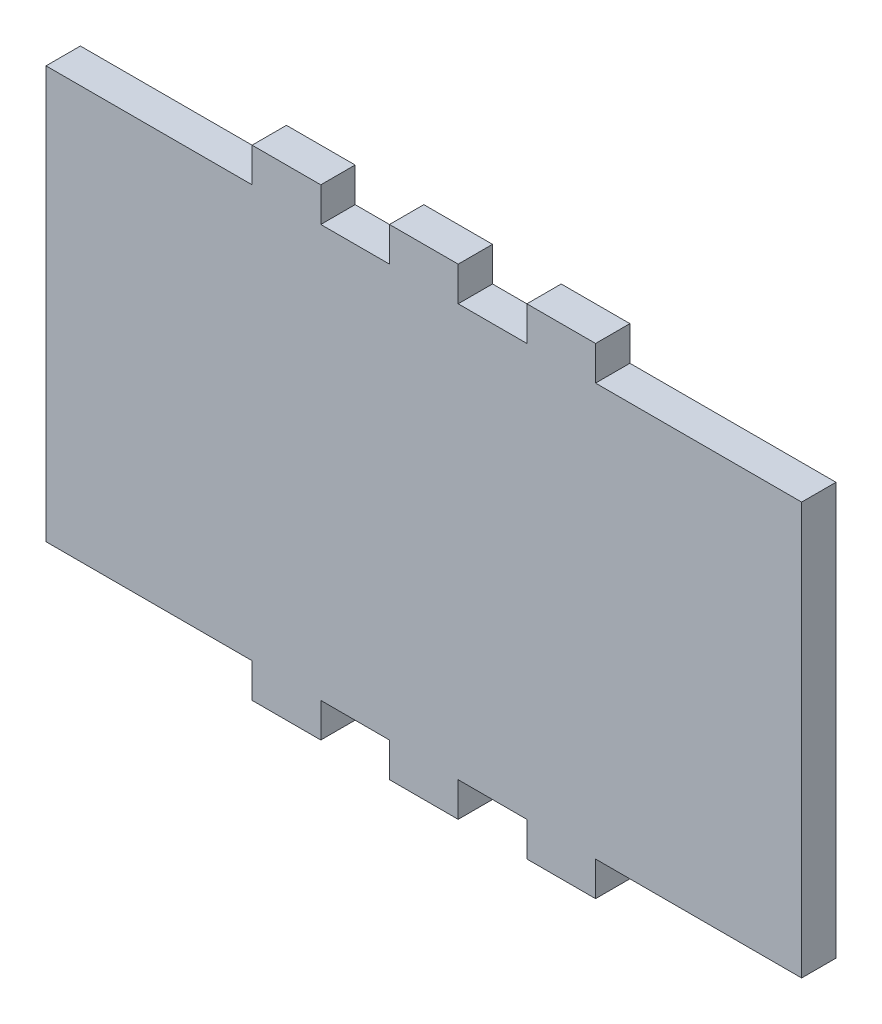
ISO-10303-21;
HEADER;
FILE_DESCRIPTION(('STEP AP214'),'2;1');
FILE_NAME('part.step','',(''),(''),'','','');
FILE_SCHEMA(('AUTOMOTIVE_DESIGN { 1 0 10303 214 1 1 1 1 }'));
ENDSEC;
DATA;
#1=APPLICATION_CONTEXT('core data for automotive mechanical design processes');
#2=APPLICATION_PROTOCOL_DEFINITION('international standard','automotive_design',2000,#1);
#3=PRODUCT_CONTEXT('',#1,'mechanical');
#4=PRODUCT('Part','Part','',(#3));
#5=PRODUCT_RELATED_PRODUCT_CATEGORY('part','',(#4));
#6=PRODUCT_DEFINITION_FORMATION('','',#4);
#7=PRODUCT_DEFINITION_CONTEXT('part definition',#1,'design');
#8=PRODUCT_DEFINITION('design','',#6,#7);
#9=PRODUCT_DEFINITION_SHAPE('','',#8);
#10=(LENGTH_UNIT() NAMED_UNIT(*) SI_UNIT(.MILLI.,.METRE.));
#11=(NAMED_UNIT(*) PLANE_ANGLE_UNIT() SI_UNIT($,.RADIAN.));
#12=(NAMED_UNIT(*) SI_UNIT($,.STERADIAN.) SOLID_ANGLE_UNIT());
#13=UNCERTAINTY_MEASURE_WITH_UNIT(LENGTH_MEASURE(1.E-05),#10,'distance_accuracy_value','');
#14=(GEOMETRIC_REPRESENTATION_CONTEXT(3) GLOBAL_UNCERTAINTY_ASSIGNED_CONTEXT((#13)) GLOBAL_UNIT_ASSIGNED_CONTEXT((#10,
#11,#12)) REPRESENTATION_CONTEXT('',''));
#15=CARTESIAN_POINT('',(0.,0.,0.));
#16=DIRECTION('',(0.,0.,1.));
#17=DIRECTION('',(1.,0.,0.));
#18=AXIS2_PLACEMENT_3D('',#15,#16,#17);
#19=CARTESIAN_POINT('',(15.875,19.05,3.175));
#20=DIRECTION('',(0.,-1.,0.));
#21=DIRECTION('',(0.,0.,-1.));
#22=AXIS2_PLACEMENT_3D('',#19,#20,#21);
#23=PLANE('',#22);
#24=DIRECTION('',(-1.,0.,0.));
#25=VECTOR('',#24,1.);
#26=CARTESIAN_POINT('',(15.875,19.05,0.));
#27=LINE('',#26,#25);
#28=CARTESIAN_POINT('',(34.925,19.05,0.));
#29=VERTEX_POINT('',#28);
#30=CARTESIAN_POINT('',(15.875,19.05,0.));
#31=VERTEX_POINT('',#30);
#32=EDGE_CURVE('E251',#29,#31,#27,.T.);
#33=ORIENTED_EDGE('',*,*,#32,.T.);
#34=DIRECTION('',(0.,0.,-1.));
#35=VECTOR('',#34,1.);
#36=CARTESIAN_POINT('',(15.875,19.05,3.175));
#37=LINE('',#36,#35);
#38=CARTESIAN_POINT('',(15.875,19.05,3.175));
#39=VERTEX_POINT('',#38);
#40=EDGE_CURVE('E11',#39,#31,#37,.T.);
#41=ORIENTED_EDGE('',*,*,#40,.F.);
#42=DIRECTION('',(-1.,0.,0.));
#43=VECTOR('',#42,1.);
#44=CARTESIAN_POINT('',(15.875,19.05,3.175));
#45=LINE('',#44,#43);
#46=CARTESIAN_POINT('',(34.925,19.05,3.175));
#47=VERTEX_POINT('',#46);
#48=EDGE_CURVE('E305',#47,#39,#45,.T.);
#49=ORIENTED_EDGE('',*,*,#48,.F.);
#50=DIRECTION('',(0.,0.,-1.));
#51=VECTOR('',#50,1.);
#52=CARTESIAN_POINT('',(34.925,19.05,3.175));
#53=LINE('',#52,#51);
#54=EDGE_CURVE('E247',#47,#29,#53,.T.);
#55=ORIENTED_EDGE('',*,*,#54,.T.);
#56=EDGE_LOOP('',(#33,#41,#49,#55));
#57=FACE_BOUND('',#56,.T.);
#58=ADVANCED_FACE('F35',(#57),#23,.F.);
#59=CARTESIAN_POINT('',(15.875,22.225,3.175));
#60=DIRECTION('',(-1.,0.,0.));
#61=DIRECTION('',(0.,0.,1.));
#62=AXIS2_PLACEMENT_3D('',#59,#60,#61);
#63=PLANE('',#62);
#64=DIRECTION('',(0.,1.,0.));
#65=VECTOR('',#64,1.);
#66=CARTESIAN_POINT('',(15.875,22.225,0.));
#67=LINE('',#66,#65);
#68=CARTESIAN_POINT('',(15.875,22.225,0.));
#69=VERTEX_POINT('',#68);
#70=EDGE_CURVE('E254',#31,#69,#67,.T.);
#71=ORIENTED_EDGE('',*,*,#70,.T.);
#72=DIRECTION('',(0.,0.,-1.));
#73=VECTOR('',#72,1.);
#74=CARTESIAN_POINT('',(15.875,22.225,3.175));
#75=LINE('',#74,#73);
#76=CARTESIAN_POINT('',(15.875,22.225,3.175));
#77=VERTEX_POINT('',#76);
#78=EDGE_CURVE('E43',#77,#69,#75,.T.);
#79=ORIENTED_EDGE('',*,*,#78,.F.);
#80=DIRECTION('',(0.,1.,0.));
#81=VECTOR('',#80,1.);
#82=CARTESIAN_POINT('',(15.875,22.225,3.175));
#83=LINE('',#82,#81);
#84=EDGE_CURVE('E154',#39,#77,#83,.T.);
#85=ORIENTED_EDGE('',*,*,#84,.F.);
#86=ORIENTED_EDGE('',*,*,#40,.T.);
#87=EDGE_LOOP('',(#71,#79,#85,#86));
#88=FACE_BOUND('',#87,.T.);
#89=ADVANCED_FACE('F463',(#88),#63,.F.);
#90=CARTESIAN_POINT('',(9.52500000000001,22.225,3.175));
#91=DIRECTION('',(0.,-1.,0.));
#92=DIRECTION('',(0.,0.,-1.));
#93=AXIS2_PLACEMENT_3D('',#90,#91,#92);
#94=PLANE('',#93);
#95=DIRECTION('',(-1.,0.,0.));
#96=VECTOR('',#95,1.);
#97=CARTESIAN_POINT('',(9.52500000000001,22.225,0.));
#98=LINE('',#97,#96);
#99=CARTESIAN_POINT('',(9.52500000000001,22.225,0.));
#100=VERTEX_POINT('',#99);
#101=EDGE_CURVE('E256',#69,#100,#98,.T.);
#102=ORIENTED_EDGE('',*,*,#101,.T.);
#103=DIRECTION('',(0.,0.,-1.));
#104=VECTOR('',#103,1.);
#105=CARTESIAN_POINT('',(9.52500000000001,22.225,3.175));
#106=LINE('',#105,#104);
#107=CARTESIAN_POINT('',(9.52500000000001,22.225,3.175));
#108=VERTEX_POINT('',#107);
#109=EDGE_CURVE('E372',#108,#100,#106,.T.);
#110=ORIENTED_EDGE('',*,*,#109,.F.);
#111=DIRECTION('',(-1.,0.,0.));
#112=VECTOR('',#111,1.);
#113=CARTESIAN_POINT('',(9.52500000000001,22.225,3.175));
#114=LINE('',#113,#112);
#115=EDGE_CURVE('E380',#77,#108,#114,.T.);
#116=ORIENTED_EDGE('',*,*,#115,.F.);
#117=ORIENTED_EDGE('',*,*,#78,.T.);
#118=EDGE_LOOP('',(#102,#110,#116,#117));
#119=FACE_BOUND('',#118,.T.);
#120=ADVANCED_FACE('F378',(#119),#94,.F.);
#121=CARTESIAN_POINT('',(9.52500000000001,19.05,3.175));
#122=DIRECTION('',(1.,0.,0.));
#123=DIRECTION('',(0.,1.,0.));
#124=AXIS2_PLACEMENT_3D('',#121,#122,#123);
#125=PLANE('',#124);
#126=DIRECTION('',(0.,-1.,0.));
#127=VECTOR('',#126,1.);
#128=CARTESIAN_POINT('',(9.52500000000001,19.05,0.));
#129=LINE('',#128,#127);
#130=CARTESIAN_POINT('',(9.52500000000001,19.05,0.));
#131=VERTEX_POINT('',#130);
#132=EDGE_CURVE('E258',#100,#131,#129,.T.);
#133=ORIENTED_EDGE('',*,*,#132,.T.);
#134=DIRECTION('',(0.,0.,-1.));
#135=VECTOR('',#134,1.);
#136=CARTESIAN_POINT('',(9.52500000000001,19.05,3.175));
#137=LINE('',#136,#135);
#138=CARTESIAN_POINT('',(9.52500000000001,19.05,3.175));
#139=VERTEX_POINT('',#138);
#140=EDGE_CURVE('E369',#139,#131,#137,.T.);
#141=ORIENTED_EDGE('',*,*,#140,.F.);
#142=DIRECTION('',(0.,-1.,0.));
#143=VECTOR('',#142,1.);
#144=CARTESIAN_POINT('',(9.52500000000001,19.05,3.175));
#145=LINE('',#144,#143);
#146=EDGE_CURVE('E398',#108,#139,#145,.T.);
#147=ORIENTED_EDGE('',*,*,#146,.F.);
#148=ORIENTED_EDGE('',*,*,#109,.T.);
#149=EDGE_LOOP('',(#133,#141,#147,#148));
#150=FACE_BOUND('',#149,.T.);
#151=ADVANCED_FACE('F389',(#150),#125,.F.);
#152=CARTESIAN_POINT('',(3.17500000000001,19.05,3.175));
#153=DIRECTION('',(0.,-1.,0.));
#154=DIRECTION('',(0.,0.,-1.));
#155=AXIS2_PLACEMENT_3D('',#152,#153,#154);
#156=PLANE('',#155);
#157=DIRECTION('',(-1.,0.,0.));
#158=VECTOR('',#157,1.);
#159=CARTESIAN_POINT('',(3.17500000000001,19.05,0.));
#160=LINE('',#159,#158);
#161=CARTESIAN_POINT('',(3.17500000000001,19.05,0.));
#162=VERTEX_POINT('',#161);
#163=EDGE_CURVE('E260',#131,#162,#160,.T.);
#164=ORIENTED_EDGE('',*,*,#163,.T.);
#165=DIRECTION('',(0.,0.,-1.));
#166=VECTOR('',#165,1.);
#167=CARTESIAN_POINT('',(3.17500000000001,19.05,3.175));
#168=LINE('',#167,#166);
#169=CARTESIAN_POINT('',(3.17500000000001,19.05,3.175));
#170=VERTEX_POINT('',#169);
#171=EDGE_CURVE('E366',#170,#162,#168,.T.);
#172=ORIENTED_EDGE('',*,*,#171,.F.);
#173=DIRECTION('',(-1.,0.,0.));
#174=VECTOR('',#173,1.);
#175=CARTESIAN_POINT('',(3.17500000000001,19.05,3.175));
#176=LINE('',#175,#174);
#177=EDGE_CURVE('E395',#139,#170,#176,.T.);
#178=ORIENTED_EDGE('',*,*,#177,.F.);
#179=ORIENTED_EDGE('',*,*,#140,.T.);
#180=EDGE_LOOP('',(#164,#172,#178,#179));
#181=FACE_BOUND('',#180,.T.);
#182=ADVANCED_FACE('F393',(#181),#156,.F.);
#183=CARTESIAN_POINT('',(3.17500000000001,22.225,3.175));
#184=DIRECTION('',(-1.,0.,0.));
#185=DIRECTION('',(0.,-1.,0.));
#186=AXIS2_PLACEMENT_3D('',#183,#184,#185);
#187=PLANE('',#186);
#188=DIRECTION('',(0.,1.,0.));
#189=VECTOR('',#188,1.);
#190=CARTESIAN_POINT('',(3.17500000000001,22.225,0.));
#191=LINE('',#190,#189);
#192=CARTESIAN_POINT('',(3.17500000000001,22.225,0.));
#193=VERTEX_POINT('',#192);
#194=EDGE_CURVE('E262',#162,#193,#191,.T.);
#195=ORIENTED_EDGE('',*,*,#194,.T.);
#196=DIRECTION('',(0.,0.,-1.));
#197=VECTOR('',#196,1.);
#198=CARTESIAN_POINT('',(3.17500000000001,22.225,3.175));
#199=LINE('',#198,#197);
#200=CARTESIAN_POINT('',(3.17500000000001,22.225,3.175));
#201=VERTEX_POINT('',#200);
#202=EDGE_CURVE('E363',#201,#193,#199,.T.);
#203=ORIENTED_EDGE('',*,*,#202,.F.);
#204=DIRECTION('',(0.,1.,0.));
#205=VECTOR('',#204,1.);
#206=CARTESIAN_POINT('',(3.17500000000001,22.225,3.175));
#207=LINE('',#206,#205);
#208=EDGE_CURVE('E397',#170,#201,#207,.T.);
#209=ORIENTED_EDGE('',*,*,#208,.F.);
#210=ORIENTED_EDGE('',*,*,#171,.T.);
#211=EDGE_LOOP('',(#195,#203,#209,#210));
#212=FACE_BOUND('',#211,.T.);
#213=ADVANCED_FACE('F476',(#212),#187,.F.);
#214=CARTESIAN_POINT('',(-3.17499999999998,22.225,3.175));
#215=DIRECTION('',(0.,-1.,0.));
#216=DIRECTION('',(0.,0.,-1.));
#217=AXIS2_PLACEMENT_3D('',#214,#215,#216);
#218=PLANE('',#217);
#219=DIRECTION('',(-1.,0.,0.));
#220=VECTOR('',#219,1.);
#221=CARTESIAN_POINT('',(-3.17499999999998,22.225,0.));
#222=LINE('',#221,#220);
#223=CARTESIAN_POINT('',(-3.17499999999998,22.225,0.));
#224=VERTEX_POINT('',#223);
#225=EDGE_CURVE('E264',#193,#224,#222,.T.);
#226=ORIENTED_EDGE('',*,*,#225,.T.);
#227=DIRECTION('',(0.,0.,-1.));
#228=VECTOR('',#227,1.);
#229=CARTESIAN_POINT('',(-3.17499999999998,22.225,3.175));
#230=LINE('',#229,#228);
#231=CARTESIAN_POINT('',(-3.17499999999998,22.225,3.175));
#232=VERTEX_POINT('',#231);
#233=EDGE_CURVE('E360',#232,#224,#230,.T.);
#234=ORIENTED_EDGE('',*,*,#233,.F.);
#235=DIRECTION('',(-1.,0.,0.));
#236=VECTOR('',#235,1.);
#237=CARTESIAN_POINT('',(-3.17499999999998,22.225,3.175));
#238=LINE('',#237,#236);
#239=EDGE_CURVE('E400',#201,#232,#238,.T.);
#240=ORIENTED_EDGE('',*,*,#239,.F.);
#241=ORIENTED_EDGE('',*,*,#202,.T.);
#242=EDGE_LOOP('',(#226,#234,#240,#241));
#243=FACE_BOUND('',#242,.T.);
#244=ADVANCED_FACE('F479',(#243),#218,.F.);
#245=CARTESIAN_POINT('',(-3.17499999999998,19.05,3.175));
#246=DIRECTION('',(1.,0.,0.));
#247=DIRECTION('',(0.,0.,-1.));
#248=AXIS2_PLACEMENT_3D('',#245,#246,#247);
#249=PLANE('',#248);
#250=DIRECTION('',(0.,-1.,0.));
#251=VECTOR('',#250,1.);
#252=CARTESIAN_POINT('',(-3.17499999999998,19.05,0.));
#253=LINE('',#252,#251);
#254=CARTESIAN_POINT('',(-3.17499999999998,19.05,0.));
#255=VERTEX_POINT('',#254);
#256=EDGE_CURVE('E266',#224,#255,#253,.T.);
#257=ORIENTED_EDGE('',*,*,#256,.T.);
#258=DIRECTION('',(0.,0.,-1.));
#259=VECTOR('',#258,1.);
#260=CARTESIAN_POINT('',(-3.17499999999998,19.05,3.175));
#261=LINE('',#260,#259);
#262=CARTESIAN_POINT('',(-3.17499999999998,19.05,3.175));
#263=VERTEX_POINT('',#262);
#264=EDGE_CURVE('E357',#263,#255,#261,.T.);
#265=ORIENTED_EDGE('',*,*,#264,.F.);
#266=DIRECTION('',(0.,-1.,0.));
#267=VECTOR('',#266,1.);
#268=CARTESIAN_POINT('',(-3.17499999999998,19.05,3.175));
#269=LINE('',#268,#267);
#270=EDGE_CURVE('E406',#232,#263,#269,.T.);
#271=ORIENTED_EDGE('',*,*,#270,.F.);
#272=ORIENTED_EDGE('',*,*,#233,.T.);
#273=EDGE_LOOP('',(#257,#265,#271,#272));
#274=FACE_BOUND('',#273,.T.);
#275=ADVANCED_FACE('F483',(#274),#249,.F.);
#276=CARTESIAN_POINT('',(-9.52499999999998,19.05,3.175));
#277=DIRECTION('',(0.,-1.,0.));
#278=DIRECTION('',(0.,0.,-1.));
#279=AXIS2_PLACEMENT_3D('',#276,#277,#278);
#280=PLANE('',#279);
#281=DIRECTION('',(-1.,0.,0.));
#282=VECTOR('',#281,1.);
#283=CARTESIAN_POINT('',(-9.52499999999998,19.05,0.));
#284=LINE('',#283,#282);
#285=CARTESIAN_POINT('',(-9.52499999999998,19.05,0.));
#286=VERTEX_POINT('',#285);
#287=EDGE_CURVE('E268',#255,#286,#284,.T.);
#288=ORIENTED_EDGE('',*,*,#287,.T.);
#289=DIRECTION('',(0.,0.,-1.));
#290=VECTOR('',#289,1.);
#291=CARTESIAN_POINT('',(-9.52499999999998,19.05,3.175));
#292=LINE('',#291,#290);
#293=CARTESIAN_POINT('',(-9.52499999999998,19.05,3.175));
#294=VERTEX_POINT('',#293);
#295=EDGE_CURVE('E354',#294,#286,#292,.T.);
#296=ORIENTED_EDGE('',*,*,#295,.F.);
#297=DIRECTION('',(-1.,0.,0.));
#298=VECTOR('',#297,1.);
#299=CARTESIAN_POINT('',(-9.52499999999998,19.05,3.175));
#300=LINE('',#299,#298);
#301=EDGE_CURVE('E408',#263,#294,#300,.T.);
#302=ORIENTED_EDGE('',*,*,#301,.F.);
#303=ORIENTED_EDGE('',*,*,#264,.T.);
#304=EDGE_LOOP('',(#288,#296,#302,#303));
#305=FACE_BOUND('',#304,.T.);
#306=ADVANCED_FACE('F487',(#305),#280,.F.);
#307=CARTESIAN_POINT('',(-9.52499999999998,22.225,3.175));
#308=DIRECTION('',(-1.,0.,0.));
#309=DIRECTION('',(0.,-1.,0.));
#310=AXIS2_PLACEMENT_3D('',#307,#308,#309);
#311=PLANE('',#310);
#312=DIRECTION('',(0.,1.,0.));
#313=VECTOR('',#312,1.);
#314=CARTESIAN_POINT('',(-9.52499999999998,22.225,0.));
#315=LINE('',#314,#313);
#316=CARTESIAN_POINT('',(-9.52499999999998,22.225,0.));
#317=VERTEX_POINT('',#316);
#318=EDGE_CURVE('E270',#286,#317,#315,.T.);
#319=ORIENTED_EDGE('',*,*,#318,.T.);
#320=DIRECTION('',(0.,0.,-1.));
#321=VECTOR('',#320,1.);
#322=CARTESIAN_POINT('',(-9.52499999999998,22.225,3.175));
#323=LINE('',#322,#321);
#324=CARTESIAN_POINT('',(-9.52499999999998,22.225,3.175));
#325=VERTEX_POINT('',#324);
#326=EDGE_CURVE('E351',#325,#317,#323,.T.);
#327=ORIENTED_EDGE('',*,*,#326,.F.);
#328=DIRECTION('',(0.,1.,0.));
#329=VECTOR('',#328,1.);
#330=CARTESIAN_POINT('',(-9.52499999999998,22.225,3.175));
#331=LINE('',#330,#329);
#332=EDGE_CURVE('E410',#294,#325,#331,.T.);
#333=ORIENTED_EDGE('',*,*,#332,.F.);
#334=ORIENTED_EDGE('',*,*,#295,.T.);
#335=EDGE_LOOP('',(#319,#327,#333,#334));
#336=FACE_BOUND('',#335,.T.);
#337=ADVANCED_FACE('F491',(#336),#311,.F.);
#338=CARTESIAN_POINT('',(-15.875,22.225,3.175));
#339=DIRECTION('',(0.,-1.,0.));
#340=DIRECTION('',(1.,0.,0.));
#341=AXIS2_PLACEMENT_3D('',#338,#339,#340);
#342=PLANE('',#341);
#343=DIRECTION('',(-1.,0.,0.));
#344=VECTOR('',#343,1.);
#345=CARTESIAN_POINT('',(-15.875,22.225,0.));
#346=LINE('',#345,#344);
#347=CARTESIAN_POINT('',(-15.875,22.225,0.));
#348=VERTEX_POINT('',#347);
#349=EDGE_CURVE('E272',#317,#348,#346,.T.);
#350=ORIENTED_EDGE('',*,*,#349,.T.);
#351=DIRECTION('',(0.,0.,-1.));
#352=VECTOR('',#351,1.);
#353=CARTESIAN_POINT('',(-15.875,22.225,3.175));
#354=LINE('',#353,#352);
#355=CARTESIAN_POINT('',(-15.875,22.225,3.175));
#356=VERTEX_POINT('',#355);
#357=EDGE_CURVE('E348',#356,#348,#354,.T.);
#358=ORIENTED_EDGE('',*,*,#357,.F.);
#359=DIRECTION('',(-1.,0.,0.));
#360=VECTOR('',#359,1.);
#361=CARTESIAN_POINT('',(-15.875,22.225,3.175));
#362=LINE('',#361,#360);
#363=EDGE_CURVE('E412',#325,#356,#362,.T.);
#364=ORIENTED_EDGE('',*,*,#363,.F.);
#365=ORIENTED_EDGE('',*,*,#326,.T.);
#366=EDGE_LOOP('',(#350,#358,#364,#365));
#367=FACE_BOUND('',#366,.T.);
#368=ADVANCED_FACE('F495',(#367),#342,.F.);
#369=CARTESIAN_POINT('',(-15.875,19.05,3.175));
#370=DIRECTION('',(1.,0.,0.));
#371=DIRECTION('',(0.,0.,-1.));
#372=AXIS2_PLACEMENT_3D('',#369,#370,#371);
#373=PLANE('',#372);
#374=DIRECTION('',(0.,-1.,0.));
#375=VECTOR('',#374,1.);
#376=CARTESIAN_POINT('',(-15.875,19.05,0.));
#377=LINE('',#376,#375);
#378=CARTESIAN_POINT('',(-15.875,19.05,0.));
#379=VERTEX_POINT('',#378);
#380=EDGE_CURVE('E274',#348,#379,#377,.T.);
#381=ORIENTED_EDGE('',*,*,#380,.T.);
#382=DIRECTION('',(0.,0.,-1.));
#383=VECTOR('',#382,1.);
#384=CARTESIAN_POINT('',(-15.875,19.05,3.175));
#385=LINE('',#384,#383);
#386=CARTESIAN_POINT('',(-15.875,19.05,3.175));
#387=VERTEX_POINT('',#386);
#388=EDGE_CURVE('E345',#387,#379,#385,.T.);
#389=ORIENTED_EDGE('',*,*,#388,.F.);
#390=DIRECTION('',(0.,-1.,0.));
#391=VECTOR('',#390,1.);
#392=CARTESIAN_POINT('',(-15.875,19.05,3.175));
#393=LINE('',#392,#391);
#394=EDGE_CURVE('E414',#356,#387,#393,.T.);
#395=ORIENTED_EDGE('',*,*,#394,.F.);
#396=ORIENTED_EDGE('',*,*,#357,.T.);
#397=EDGE_LOOP('',(#381,#389,#395,#396));
#398=FACE_BOUND('',#397,.T.);
#399=ADVANCED_FACE('F499',(#398),#373,.F.);
#400=CARTESIAN_POINT('',(-15.875,19.05,3.175));
#401=DIRECTION('',(0.,-1.,0.));
#402=DIRECTION('',(0.,0.,-1.));
#403=AXIS2_PLACEMENT_3D('',#400,#401,#402);
#404=PLANE('',#403);
#405=DIRECTION('',(-1.,0.,0.));
#406=VECTOR('',#405,1.);
#407=CARTESIAN_POINT('',(-15.875,19.05,0.));
#408=LINE('',#407,#406);
#409=CARTESIAN_POINT('',(-34.925,19.05,0.));
#410=VERTEX_POINT('',#409);
#411=EDGE_CURVE('E276',#379,#410,#408,.T.);
#412=ORIENTED_EDGE('',*,*,#411,.T.);
#413=DIRECTION('',(0.,0.,-1.));
#414=VECTOR('',#413,1.);
#415=CARTESIAN_POINT('',(-34.925,19.05,3.175));
#416=LINE('',#415,#414);
#417=CARTESIAN_POINT('',(-34.925,19.05,3.175));
#418=VERTEX_POINT('',#417);
#419=EDGE_CURVE('E342',#418,#410,#416,.T.);
#420=ORIENTED_EDGE('',*,*,#419,.F.);
#421=DIRECTION('',(-1.,0.,0.));
#422=VECTOR('',#421,1.);
#423=CARTESIAN_POINT('',(-15.875,19.05,3.175));
#424=LINE('',#423,#422);
#425=EDGE_CURVE('E416',#387,#418,#424,.T.);
#426=ORIENTED_EDGE('',*,*,#425,.F.);
#427=ORIENTED_EDGE('',*,*,#388,.T.);
#428=EDGE_LOOP('',(#412,#420,#426,#427));
#429=FACE_BOUND('',#428,.T.);
#430=ADVANCED_FACE('F503',(#429),#404,.F.);
#431=CARTESIAN_POINT('',(-34.925,-19.05,3.175));
#432=DIRECTION('',(1.,0.,0.));
#433=DIRECTION('',(0.,0.,-1.));
#434=AXIS2_PLACEMENT_3D('',#431,#432,#433);
#435=PLANE('',#434);
#436=DIRECTION('',(0.,-1.,0.));
#437=VECTOR('',#436,1.);
#438=CARTESIAN_POINT('',(-34.925,-19.05,0.));
#439=LINE('',#438,#437);
#440=CARTESIAN_POINT('',(-34.925,-19.05,0.));
#441=VERTEX_POINT('',#440);
#442=EDGE_CURVE('E278',#410,#441,#439,.T.);
#443=ORIENTED_EDGE('',*,*,#442,.T.);
#444=DIRECTION('',(0.,0.,-1.));
#445=VECTOR('',#444,1.);
#446=CARTESIAN_POINT('',(-34.925,-19.05,3.175));
#447=LINE('',#446,#445);
#448=CARTESIAN_POINT('',(-34.925,-19.05,3.175));
#449=VERTEX_POINT('',#448);
#450=EDGE_CURVE('E339',#449,#441,#447,.T.);
#451=ORIENTED_EDGE('',*,*,#450,.F.);
#452=DIRECTION('',(0.,-1.,0.));
#453=VECTOR('',#452,1.);
#454=CARTESIAN_POINT('',(-34.925,-19.05,3.175));
#455=LINE('',#454,#453);
#456=EDGE_CURVE('E418',#418,#449,#455,.T.);
#457=ORIENTED_EDGE('',*,*,#456,.F.);
#458=ORIENTED_EDGE('',*,*,#419,.T.);
#459=EDGE_LOOP('',(#443,#451,#457,#458));
#460=FACE_BOUND('',#459,.T.);
#461=ADVANCED_FACE('F507',(#460),#435,.F.);
#462=CARTESIAN_POINT('',(-15.875,-19.05,3.175));
#463=DIRECTION('',(0.,1.,0.));
#464=DIRECTION('',(0.,0.,1.));
#465=AXIS2_PLACEMENT_3D('',#462,#463,#464);
#466=PLANE('',#465);
#467=DIRECTION('',(1.,0.,0.));
#468=VECTOR('',#467,1.);
#469=CARTESIAN_POINT('',(-15.875,-19.05,0.));
#470=LINE('',#469,#468);
#471=CARTESIAN_POINT('',(-15.875,-19.05,0.));
#472=VERTEX_POINT('',#471);
#473=EDGE_CURVE('E280',#441,#472,#470,.T.);
#474=ORIENTED_EDGE('',*,*,#473,.T.);
#475=DIRECTION('',(0.,0.,-1.));
#476=VECTOR('',#475,1.);
#477=CARTESIAN_POINT('',(-15.875,-19.05,3.175));
#478=LINE('',#477,#476);
#479=CARTESIAN_POINT('',(-15.875,-19.05,3.175));
#480=VERTEX_POINT('',#479);
#481=EDGE_CURVE('E336',#480,#472,#478,.T.);
#482=ORIENTED_EDGE('',*,*,#481,.F.);
#483=DIRECTION('',(1.,0.,0.));
#484=VECTOR('',#483,1.);
#485=CARTESIAN_POINT('',(-15.875,-19.05,3.175));
#486=LINE('',#485,#484);
#487=EDGE_CURVE('E420',#449,#480,#486,.T.);
#488=ORIENTED_EDGE('',*,*,#487,.F.);
#489=ORIENTED_EDGE('',*,*,#450,.T.);
#490=EDGE_LOOP('',(#474,#482,#488,#489));
#491=FACE_BOUND('',#490,.T.);
#492=ADVANCED_FACE('F511',(#491),#466,.F.);
#493=CARTESIAN_POINT('',(-15.875,-19.05,3.175));
#494=DIRECTION('',(1.,0.,0.));
#495=DIRECTION('',(0.,0.,-1.));
#496=AXIS2_PLACEMENT_3D('',#493,#494,#495);
#497=PLANE('',#496);
#498=DIRECTION('',(0.,-1.,0.));
#499=VECTOR('',#498,1.);
#500=CARTESIAN_POINT('',(-15.875,-19.05,0.));
#501=LINE('',#500,#499);
#502=CARTESIAN_POINT('',(-15.875,-22.225,0.));
#503=VERTEX_POINT('',#502);
#504=EDGE_CURVE('E282',#472,#503,#501,.T.);
#505=ORIENTED_EDGE('',*,*,#504,.T.);
#506=DIRECTION('',(0.,0.,-1.));
#507=VECTOR('',#506,1.);
#508=CARTESIAN_POINT('',(-15.875,-22.225,3.175));
#509=LINE('',#508,#507);
#510=CARTESIAN_POINT('',(-15.875,-22.225,3.175));
#511=VERTEX_POINT('',#510);
#512=EDGE_CURVE('E333',#511,#503,#509,.T.);
#513=ORIENTED_EDGE('',*,*,#512,.F.);
#514=DIRECTION('',(0.,-1.,0.));
#515=VECTOR('',#514,1.);
#516=CARTESIAN_POINT('',(-15.875,-19.05,3.175));
#517=LINE('',#516,#515);
#518=EDGE_CURVE('E422',#480,#511,#517,.T.);
#519=ORIENTED_EDGE('',*,*,#518,.F.);
#520=ORIENTED_EDGE('',*,*,#481,.T.);
#521=EDGE_LOOP('',(#505,#513,#519,#520));
#522=FACE_BOUND('',#521,.T.);
#523=ADVANCED_FACE('F515',(#522),#497,.F.);
#524=CARTESIAN_POINT('',(-15.875,-22.225,3.175));
#525=DIRECTION('',(0.,1.,0.));
#526=DIRECTION('',(-1.,0.,0.));
#527=AXIS2_PLACEMENT_3D('',#524,#525,#526);
#528=PLANE('',#527);
#529=DIRECTION('',(1.,0.,0.));
#530=VECTOR('',#529,1.);
#531=CARTESIAN_POINT('',(-15.875,-22.225,0.));
#532=LINE('',#531,#530);
#533=CARTESIAN_POINT('',(-9.52499999999998,-22.225,0.));
#534=VERTEX_POINT('',#533);
#535=EDGE_CURVE('E284',#503,#534,#532,.T.);
#536=ORIENTED_EDGE('',*,*,#535,.T.);
#537=DIRECTION('',(0.,0.,-1.));
#538=VECTOR('',#537,1.);
#539=CARTESIAN_POINT('',(-9.52499999999998,-22.225,3.175));
#540=LINE('',#539,#538);
#541=CARTESIAN_POINT('',(-9.52499999999998,-22.225,3.175));
#542=VERTEX_POINT('',#541);
#543=EDGE_CURVE('E330',#542,#534,#540,.T.);
#544=ORIENTED_EDGE('',*,*,#543,.F.);
#545=DIRECTION('',(1.,0.,0.));
#546=VECTOR('',#545,1.);
#547=CARTESIAN_POINT('',(-15.875,-22.225,3.175));
#548=LINE('',#547,#546);
#549=EDGE_CURVE('E424',#511,#542,#548,.T.);
#550=ORIENTED_EDGE('',*,*,#549,.F.);
#551=ORIENTED_EDGE('',*,*,#512,.T.);
#552=EDGE_LOOP('',(#536,#544,#550,#551));
#553=FACE_BOUND('',#552,.T.);
#554=ADVANCED_FACE('F519',(#553),#528,.F.);
#555=CARTESIAN_POINT('',(-9.52499999999998,-22.225,3.175));
#556=DIRECTION('',(-1.,0.,0.));
#557=DIRECTION('',(0.,-1.,0.));
#558=AXIS2_PLACEMENT_3D('',#555,#556,#557);
#559=PLANE('',#558);
#560=DIRECTION('',(0.,1.,0.));
#561=VECTOR('',#560,1.);
#562=CARTESIAN_POINT('',(-9.52499999999998,-22.225,0.));
#563=LINE('',#562,#561);
#564=CARTESIAN_POINT('',(-9.52499999999998,-19.05,0.));
#565=VERTEX_POINT('',#564);
#566=EDGE_CURVE('E286',#534,#565,#563,.T.);
#567=ORIENTED_EDGE('',*,*,#566,.T.);
#568=DIRECTION('',(0.,0.,-1.));
#569=VECTOR('',#568,1.);
#570=CARTESIAN_POINT('',(-9.52499999999998,-19.05,3.175));
#571=LINE('',#570,#569);
#572=CARTESIAN_POINT('',(-9.52499999999998,-19.05,3.175));
#573=VERTEX_POINT('',#572);
#574=EDGE_CURVE('E327',#573,#565,#571,.T.);
#575=ORIENTED_EDGE('',*,*,#574,.F.);
#576=DIRECTION('',(0.,1.,0.));
#577=VECTOR('',#576,1.);
#578=CARTESIAN_POINT('',(-9.52499999999998,-22.225,3.175));
#579=LINE('',#578,#577);
#580=EDGE_CURVE('E426',#542,#573,#579,.T.);
#581=ORIENTED_EDGE('',*,*,#580,.F.);
#582=ORIENTED_EDGE('',*,*,#543,.T.);
#583=EDGE_LOOP('',(#567,#575,#581,#582));
#584=FACE_BOUND('',#583,.T.);
#585=ADVANCED_FACE('F523',(#584),#559,.F.);
#586=CARTESIAN_POINT('',(-9.52499999999998,-19.05,3.175));
#587=DIRECTION('',(0.,1.,0.));
#588=DIRECTION('',(0.,0.,1.));
#589=AXIS2_PLACEMENT_3D('',#586,#587,#588);
#590=PLANE('',#589);
#591=DIRECTION('',(1.,0.,0.));
#592=VECTOR('',#591,1.);
#593=CARTESIAN_POINT('',(-9.52499999999998,-19.05,0.));
#594=LINE('',#593,#592);
#595=CARTESIAN_POINT('',(-3.17499999999998,-19.05,0.));
#596=VERTEX_POINT('',#595);
#597=EDGE_CURVE('E288',#565,#596,#594,.T.);
#598=ORIENTED_EDGE('',*,*,#597,.T.);
#599=DIRECTION('',(0.,0.,-1.));
#600=VECTOR('',#599,1.);
#601=CARTESIAN_POINT('',(-3.17499999999998,-19.05,3.175));
#602=LINE('',#601,#600);
#603=CARTESIAN_POINT('',(-3.17499999999998,-19.05,3.175));
#604=VERTEX_POINT('',#603);
#605=EDGE_CURVE('E324',#604,#596,#602,.T.);
#606=ORIENTED_EDGE('',*,*,#605,.F.);
#607=DIRECTION('',(1.,0.,0.));
#608=VECTOR('',#607,1.);
#609=CARTESIAN_POINT('',(-9.52499999999998,-19.05,3.175));
#610=LINE('',#609,#608);
#611=EDGE_CURVE('E428',#573,#604,#610,.T.);
#612=ORIENTED_EDGE('',*,*,#611,.F.);
#613=ORIENTED_EDGE('',*,*,#574,.T.);
#614=EDGE_LOOP('',(#598,#606,#612,#613));
#615=FACE_BOUND('',#614,.T.);
#616=ADVANCED_FACE('F527',(#615),#590,.F.);
#617=CARTESIAN_POINT('',(-3.17499999999998,-19.05,3.175));
#618=DIRECTION('',(1.,0.,0.));
#619=DIRECTION('',(0.,0.,-1.));
#620=AXIS2_PLACEMENT_3D('',#617,#618,#619);
#621=PLANE('',#620);
#622=DIRECTION('',(0.,-1.,0.));
#623=VECTOR('',#622,1.);
#624=CARTESIAN_POINT('',(-3.17499999999998,-19.05,0.));
#625=LINE('',#624,#623);
#626=CARTESIAN_POINT('',(-3.17499999999998,-22.225,0.));
#627=VERTEX_POINT('',#626);
#628=EDGE_CURVE('E290',#596,#627,#625,.T.);
#629=ORIENTED_EDGE('',*,*,#628,.T.);
#630=DIRECTION('',(0.,0.,-1.));
#631=VECTOR('',#630,1.);
#632=CARTESIAN_POINT('',(-3.17499999999998,-22.225,3.175));
#633=LINE('',#632,#631);
#634=CARTESIAN_POINT('',(-3.17499999999998,-22.225,3.175));
#635=VERTEX_POINT('',#634);
#636=EDGE_CURVE('E321',#635,#627,#633,.T.);
#637=ORIENTED_EDGE('',*,*,#636,.F.);
#638=DIRECTION('',(0.,-1.,0.));
#639=VECTOR('',#638,1.);
#640=CARTESIAN_POINT('',(-3.17499999999998,-19.05,3.175));
#641=LINE('',#640,#639);
#642=EDGE_CURVE('E430',#604,#635,#641,.T.);
#643=ORIENTED_EDGE('',*,*,#642,.F.);
#644=ORIENTED_EDGE('',*,*,#605,.T.);
#645=EDGE_LOOP('',(#629,#637,#643,#644));
#646=FACE_BOUND('',#645,.T.);
#647=ADVANCED_FACE('F531',(#646),#621,.F.);
#648=CARTESIAN_POINT('',(-3.17499999999998,-22.225,3.175));
#649=DIRECTION('',(0.,1.,0.));
#650=DIRECTION('',(0.,0.,1.));
#651=AXIS2_PLACEMENT_3D('',#648,#649,#650);
#652=PLANE('',#651);
#653=DIRECTION('',(1.,0.,0.));
#654=VECTOR('',#653,1.);
#655=CARTESIAN_POINT('',(-3.17499999999998,-22.225,0.));
#656=LINE('',#655,#654);
#657=CARTESIAN_POINT('',(3.17500000000001,-22.225,0.));
#658=VERTEX_POINT('',#657);
#659=EDGE_CURVE('E292',#627,#658,#656,.T.);
#660=ORIENTED_EDGE('',*,*,#659,.T.);
#661=DIRECTION('',(0.,0.,-1.));
#662=VECTOR('',#661,1.);
#663=CARTESIAN_POINT('',(3.17500000000001,-22.225,3.175));
#664=LINE('',#663,#662);
#665=CARTESIAN_POINT('',(3.17500000000001,-22.225,3.175));
#666=VERTEX_POINT('',#665);
#667=EDGE_CURVE('E318',#666,#658,#664,.T.);
#668=ORIENTED_EDGE('',*,*,#667,.F.);
#669=DIRECTION('',(1.,0.,0.));
#670=VECTOR('',#669,1.);
#671=CARTESIAN_POINT('',(-3.17499999999998,-22.225,3.175));
#672=LINE('',#671,#670);
#673=EDGE_CURVE('E432',#635,#666,#672,.T.);
#674=ORIENTED_EDGE('',*,*,#673,.F.);
#675=ORIENTED_EDGE('',*,*,#636,.T.);
#676=EDGE_LOOP('',(#660,#668,#674,#675));
#677=FACE_BOUND('',#676,.T.);
#678=ADVANCED_FACE('F535',(#677),#652,.F.);
#679=CARTESIAN_POINT('',(3.17500000000001,-22.225,3.175));
#680=DIRECTION('',(-1.,0.,0.));
#681=DIRECTION('',(0.,0.,1.));
#682=AXIS2_PLACEMENT_3D('',#679,#680,#681);
#683=PLANE('',#682);
#684=DIRECTION('',(0.,1.,0.));
#685=VECTOR('',#684,1.);
#686=CARTESIAN_POINT('',(3.17500000000001,-22.225,0.));
#687=LINE('',#686,#685);
#688=CARTESIAN_POINT('',(3.17500000000001,-19.05,0.));
#689=VERTEX_POINT('',#688);
#690=EDGE_CURVE('E294',#658,#689,#687,.T.);
#691=ORIENTED_EDGE('',*,*,#690,.T.);
#692=DIRECTION('',(0.,0.,-1.));
#693=VECTOR('',#692,1.);
#694=CARTESIAN_POINT('',(3.17500000000001,-19.05,3.175));
#695=LINE('',#694,#693);
#696=CARTESIAN_POINT('',(3.17500000000001,-19.05,3.175));
#697=VERTEX_POINT('',#696);
#698=EDGE_CURVE('E315',#697,#689,#695,.T.);
#699=ORIENTED_EDGE('',*,*,#698,.F.);
#700=DIRECTION('',(0.,1.,0.));
#701=VECTOR('',#700,1.);
#702=CARTESIAN_POINT('',(3.17500000000001,-22.225,3.175));
#703=LINE('',#702,#701);
#704=EDGE_CURVE('E434',#666,#697,#703,.T.);
#705=ORIENTED_EDGE('',*,*,#704,.F.);
#706=ORIENTED_EDGE('',*,*,#667,.T.);
#707=EDGE_LOOP('',(#691,#699,#705,#706));
#708=FACE_BOUND('',#707,.T.);
#709=ADVANCED_FACE('F539',(#708),#683,.F.);
#710=CARTESIAN_POINT('',(9.52500000000001,-19.05,3.175));
#711=DIRECTION('',(0.,1.,0.));
#712=DIRECTION('',(0.,0.,1.));
#713=AXIS2_PLACEMENT_3D('',#710,#711,#712);
#714=PLANE('',#713);
#715=DIRECTION('',(1.,0.,0.));
#716=VECTOR('',#715,1.);
#717=CARTESIAN_POINT('',(9.52500000000001,-19.05,0.));
#718=LINE('',#717,#716);
#719=CARTESIAN_POINT('',(9.52500000000001,-19.05,0.));
#720=VERTEX_POINT('',#719);
#721=EDGE_CURVE('E296',#689,#720,#718,.T.);
#722=ORIENTED_EDGE('',*,*,#721,.T.);
#723=DIRECTION('',(0.,0.,-1.));
#724=VECTOR('',#723,1.);
#725=CARTESIAN_POINT('',(9.52500000000001,-19.05,3.175));
#726=LINE('',#725,#724);
#727=CARTESIAN_POINT('',(9.52500000000001,-19.05,3.175));
#728=VERTEX_POINT('',#727);
#729=EDGE_CURVE('E312',#728,#720,#726,.T.);
#730=ORIENTED_EDGE('',*,*,#729,.F.);
#731=DIRECTION('',(1.,0.,0.));
#732=VECTOR('',#731,1.);
#733=CARTESIAN_POINT('',(9.52500000000001,-19.05,3.175));
#734=LINE('',#733,#732);
#735=EDGE_CURVE('E436',#697,#728,#734,.T.);
#736=ORIENTED_EDGE('',*,*,#735,.F.);
#737=ORIENTED_EDGE('',*,*,#698,.T.);
#738=EDGE_LOOP('',(#722,#730,#736,#737));
#739=FACE_BOUND('',#738,.T.);
#740=ADVANCED_FACE('F543',(#739),#714,.F.);
#741=CARTESIAN_POINT('',(9.52500000000001,-19.05,3.175));
#742=DIRECTION('',(1.,0.,0.));
#743=DIRECTION('',(0.,1.,0.));
#744=AXIS2_PLACEMENT_3D('',#741,#742,#743);
#745=PLANE('',#744);
#746=DIRECTION('',(0.,-1.,0.));
#747=VECTOR('',#746,1.);
#748=CARTESIAN_POINT('',(9.52500000000001,-19.05,0.));
#749=LINE('',#748,#747);
#750=CARTESIAN_POINT('',(9.52500000000001,-22.225,0.));
#751=VERTEX_POINT('',#750);
#752=EDGE_CURVE('E298',#720,#751,#749,.T.);
#753=ORIENTED_EDGE('',*,*,#752,.T.);
#754=DIRECTION('',(0.,0.,-1.));
#755=VECTOR('',#754,1.);
#756=CARTESIAN_POINT('',(9.52500000000001,-22.225,3.175));
#757=LINE('',#756,#755);
#758=CARTESIAN_POINT('',(9.52500000000001,-22.225,3.175));
#759=VERTEX_POINT('',#758);
#760=EDGE_CURVE('E309',#759,#751,#757,.T.);
#761=ORIENTED_EDGE('',*,*,#760,.F.);
#762=DIRECTION('',(0.,-1.,0.));
#763=VECTOR('',#762,1.);
#764=CARTESIAN_POINT('',(9.52500000000001,-19.05,3.175));
#765=LINE('',#764,#763);
#766=EDGE_CURVE('E438',#728,#759,#765,.T.);
#767=ORIENTED_EDGE('',*,*,#766,.F.);
#768=ORIENTED_EDGE('',*,*,#729,.T.);
#769=EDGE_LOOP('',(#753,#761,#767,#768));
#770=FACE_BOUND('',#769,.T.);
#771=ADVANCED_FACE('F444',(#770),#745,.F.);
#772=CARTESIAN_POINT('',(9.52500000000001,-22.225,3.175));
#773=DIRECTION('',(0.,1.,0.));
#774=DIRECTION('',(0.,0.,1.));
#775=AXIS2_PLACEMENT_3D('',#772,#773,#774);
#776=PLANE('',#775);
#777=DIRECTION('',(1.,0.,0.));
#778=VECTOR('',#777,1.);
#779=CARTESIAN_POINT('',(9.52500000000001,-22.225,0.));
#780=LINE('',#779,#778);
#781=CARTESIAN_POINT('',(15.875,-22.225,0.));
#782=VERTEX_POINT('',#781);
#783=EDGE_CURVE('E300',#751,#782,#780,.T.);
#784=ORIENTED_EDGE('',*,*,#783,.T.);
#785=DIRECTION('',(0.,0.,-1.));
#786=VECTOR('',#785,1.);
#787=CARTESIAN_POINT('',(15.875,-22.225,3.175));
#788=LINE('',#787,#786);
#789=CARTESIAN_POINT('',(15.875,-22.225,3.175));
#790=VERTEX_POINT('',#789);
#791=EDGE_CURVE('E242',#790,#782,#788,.T.);
#792=ORIENTED_EDGE('',*,*,#791,.F.);
#793=DIRECTION('',(1.,0.,0.));
#794=VECTOR('',#793,1.);
#795=CARTESIAN_POINT('',(9.52500000000001,-22.225,3.175));
#796=LINE('',#795,#794);
#797=EDGE_CURVE('E233',#759,#790,#796,.T.);
#798=ORIENTED_EDGE('',*,*,#797,.F.);
#799=ORIENTED_EDGE('',*,*,#760,.T.);
#800=EDGE_LOOP('',(#784,#792,#798,#799));
#801=FACE_BOUND('',#800,.T.);
#802=ADVANCED_FACE('F448',(#801),#776,.F.);
#803=CARTESIAN_POINT('',(15.875,-22.225,3.175));
#804=DIRECTION('',(-1.,0.,0.));
#805=DIRECTION('',(0.,0.,1.));
#806=AXIS2_PLACEMENT_3D('',#803,#804,#805);
#807=PLANE('',#806);
#808=DIRECTION('',(0.,1.,0.));
#809=VECTOR('',#808,1.);
#810=CARTESIAN_POINT('',(15.875,-22.225,0.));
#811=LINE('',#810,#809);
#812=CARTESIAN_POINT('',(15.875,-19.05,0.));
#813=VERTEX_POINT('',#812);
#814=EDGE_CURVE('E241',#782,#813,#811,.T.);
#815=ORIENTED_EDGE('',*,*,#814,.T.);
#816=DIRECTION('',(0.,0.,-1.));
#817=VECTOR('',#816,1.);
#818=CARTESIAN_POINT('',(15.875,-19.05,3.175));
#819=LINE('',#818,#817);
#820=CARTESIAN_POINT('',(15.875,-19.05,3.175));
#821=VERTEX_POINT('',#820);
#822=EDGE_CURVE('E238',#821,#813,#819,.T.);
#823=ORIENTED_EDGE('',*,*,#822,.F.);
#824=DIRECTION('',(0.,1.,0.));
#825=VECTOR('',#824,1.);
#826=CARTESIAN_POINT('',(15.875,-22.225,3.175));
#827=LINE('',#826,#825);
#828=EDGE_CURVE('E227',#790,#821,#827,.T.);
#829=ORIENTED_EDGE('',*,*,#828,.F.);
#830=ORIENTED_EDGE('',*,*,#791,.T.);
#831=EDGE_LOOP('',(#815,#823,#829,#830));
#832=FACE_BOUND('',#831,.T.);
#833=ADVANCED_FACE('F239',(#832),#807,.F.);
#834=CARTESIAN_POINT('',(34.925,-19.05,3.175));
#835=DIRECTION('',(0.,1.,0.));
#836=DIRECTION('',(0.,0.,1.));
#837=AXIS2_PLACEMENT_3D('',#834,#835,#836);
#838=PLANE('',#837);
#839=DIRECTION('',(1.,0.,0.));
#840=VECTOR('',#839,1.);
#841=CARTESIAN_POINT('',(34.925,-19.05,0.));
#842=LINE('',#841,#840);
#843=CARTESIAN_POINT('',(34.925,-19.05,0.));
#844=VERTEX_POINT('',#843);
#845=EDGE_CURVE('E140',#813,#844,#842,.T.);
#846=ORIENTED_EDGE('',*,*,#845,.T.);
#847=DIRECTION('',(0.,0.,-1.));
#848=VECTOR('',#847,1.);
#849=CARTESIAN_POINT('',(34.925,-19.05,3.175));
#850=LINE('',#849,#848);
#851=CARTESIAN_POINT('',(34.925,-19.05,3.175));
#852=VERTEX_POINT('',#851);
#853=EDGE_CURVE('E243',#852,#844,#850,.T.);
#854=ORIENTED_EDGE('',*,*,#853,.F.);
#855=DIRECTION('',(1.,0.,0.));
#856=VECTOR('',#855,1.);
#857=CARTESIAN_POINT('',(34.925,-19.05,3.175));
#858=LINE('',#857,#856);
#859=EDGE_CURVE('E231',#821,#852,#858,.T.);
#860=ORIENTED_EDGE('',*,*,#859,.F.);
#861=ORIENTED_EDGE('',*,*,#822,.T.);
#862=EDGE_LOOP('',(#846,#854,#860,#861));
#863=FACE_BOUND('',#862,.T.);
#864=ADVANCED_FACE('F245',(#863),#838,.F.);
#865=CARTESIAN_POINT('',(34.925,-19.05,3.175));
#866=DIRECTION('',(-1.,0.,0.));
#867=DIRECTION('',(0.,0.,1.));
#868=AXIS2_PLACEMENT_3D('',#865,#866,#867);
#869=PLANE('',#868);
#870=DIRECTION('',(0.,1.,0.));
#871=VECTOR('',#870,1.);
#872=CARTESIAN_POINT('',(34.925,-19.05,0.));
#873=LINE('',#872,#871);
#874=EDGE_CURVE('E146',#844,#29,#873,.T.);
#875=ORIENTED_EDGE('',*,*,#874,.T.);
#876=ORIENTED_EDGE('',*,*,#54,.F.);
#877=DIRECTION('',(0.,1.,0.));
#878=VECTOR('',#877,1.);
#879=CARTESIAN_POINT('',(34.925,-19.05,3.175));
#880=LINE('',#879,#878);
#881=EDGE_CURVE('E51',#852,#47,#880,.T.);
#882=ORIENTED_EDGE('',*,*,#881,.F.);
#883=ORIENTED_EDGE('',*,*,#853,.T.);
#884=EDGE_LOOP('',(#875,#876,#882,#883));
#885=FACE_BOUND('',#884,.T.);
#886=ADVANCED_FACE('F452',(#885),#869,.F.);
#887=CARTESIAN_POINT('',(0.,0.,3.175));
#888=DIRECTION('',(0.,0.,1.));
#889=DIRECTION('',(1.,0.,0.));
#890=AXIS2_PLACEMENT_3D('',#887,#888,#889);
#891=PLANE('',#890);
#892=ORIENTED_EDGE('',*,*,#48,.T.);
#893=ORIENTED_EDGE('',*,*,#84,.T.);
#894=ORIENTED_EDGE('',*,*,#115,.T.);
#895=ORIENTED_EDGE('',*,*,#146,.T.);
#896=ORIENTED_EDGE('',*,*,#177,.T.);
#897=ORIENTED_EDGE('',*,*,#208,.T.);
#898=ORIENTED_EDGE('',*,*,#239,.T.);
#899=ORIENTED_EDGE('',*,*,#270,.T.);
#900=ORIENTED_EDGE('',*,*,#301,.T.);
#901=ORIENTED_EDGE('',*,*,#332,.T.);
#902=ORIENTED_EDGE('',*,*,#363,.T.);
#903=ORIENTED_EDGE('',*,*,#394,.T.);
#904=ORIENTED_EDGE('',*,*,#425,.T.);
#905=ORIENTED_EDGE('',*,*,#456,.T.);
#906=ORIENTED_EDGE('',*,*,#487,.T.);
#907=ORIENTED_EDGE('',*,*,#518,.T.);
#908=ORIENTED_EDGE('',*,*,#549,.T.);
#909=ORIENTED_EDGE('',*,*,#580,.T.);
#910=ORIENTED_EDGE('',*,*,#611,.T.);
#911=ORIENTED_EDGE('',*,*,#642,.T.);
#912=ORIENTED_EDGE('',*,*,#673,.T.);
#913=ORIENTED_EDGE('',*,*,#704,.T.);
#914=ORIENTED_EDGE('',*,*,#735,.T.);
#915=ORIENTED_EDGE('',*,*,#766,.T.);
#916=ORIENTED_EDGE('',*,*,#797,.T.);
#917=ORIENTED_EDGE('',*,*,#828,.T.);
#918=ORIENTED_EDGE('',*,*,#859,.T.);
#919=ORIENTED_EDGE('',*,*,#881,.T.);
#920=EDGE_LOOP('',(#892,#893,#894,#895,#896,#897,#898,#899,#900,#901,#902,#903,#904,#905,#906,
#907,#908,#909,#910,#911,#912,#913,#914,#915,#916,#917,#918,#919));
#921=FACE_BOUND('',#920,.T.);
#922=ADVANCED_FACE('F229',(#921),#891,.T.);
#923=CARTESIAN_POINT('',(0.,0.,0.));
#924=DIRECTION('',(0.,0.,1.));
#925=DIRECTION('',(1.,0.,0.));
#926=AXIS2_PLACEMENT_3D('',#923,#924,#925);
#927=PLANE('',#926);
#928=ORIENTED_EDGE('',*,*,#32,.F.);
#929=ORIENTED_EDGE('',*,*,#874,.F.);
#930=ORIENTED_EDGE('',*,*,#845,.F.);
#931=ORIENTED_EDGE('',*,*,#814,.F.);
#932=ORIENTED_EDGE('',*,*,#783,.F.);
#933=ORIENTED_EDGE('',*,*,#752,.F.);
#934=ORIENTED_EDGE('',*,*,#721,.F.);
#935=ORIENTED_EDGE('',*,*,#690,.F.);
#936=ORIENTED_EDGE('',*,*,#659,.F.);
#937=ORIENTED_EDGE('',*,*,#628,.F.);
#938=ORIENTED_EDGE('',*,*,#597,.F.);
#939=ORIENTED_EDGE('',*,*,#566,.F.);
#940=ORIENTED_EDGE('',*,*,#535,.F.);
#941=ORIENTED_EDGE('',*,*,#504,.F.);
#942=ORIENTED_EDGE('',*,*,#473,.F.);
#943=ORIENTED_EDGE('',*,*,#442,.F.);
#944=ORIENTED_EDGE('',*,*,#411,.F.);
#945=ORIENTED_EDGE('',*,*,#380,.F.);
#946=ORIENTED_EDGE('',*,*,#349,.F.);
#947=ORIENTED_EDGE('',*,*,#318,.F.);
#948=ORIENTED_EDGE('',*,*,#287,.F.);
#949=ORIENTED_EDGE('',*,*,#256,.F.);
#950=ORIENTED_EDGE('',*,*,#225,.F.);
#951=ORIENTED_EDGE('',*,*,#194,.F.);
#952=ORIENTED_EDGE('',*,*,#163,.F.);
#953=ORIENTED_EDGE('',*,*,#132,.F.);
#954=ORIENTED_EDGE('',*,*,#101,.F.);
#955=ORIENTED_EDGE('',*,*,#70,.F.);
#956=EDGE_LOOP('',(#928,#929,#930,#931,#932,#933,#934,#935,#936,#937,#938,#939,#940,#941,#942,
#943,#944,#945,#946,#947,#948,#949,#950,#951,#952,#953,#954,#955));
#957=FACE_BOUND('',#956,.T.);
#958=ADVANCED_FACE('F384',(#957),#927,.F.);
#959=CLOSED_SHELL('',(#58,#89,#120,#151,#182,#213,#244,#275,#306,#337,#368,#399,#430,#461,#492,
#523,#554,#585,#616,#647,#678,#709,#740,#771,#802,#833,#864,#886,#922,#958));
#960=MANIFOLD_SOLID_BREP('B2',#959);
#961=ADVANCED_BREP_SHAPE_REPRESENTATION('',(#18,#960),#14);
#962=SHAPE_DEFINITION_REPRESENTATION(#9,#961);
ENDSEC;
END-ISO-10303-21;
